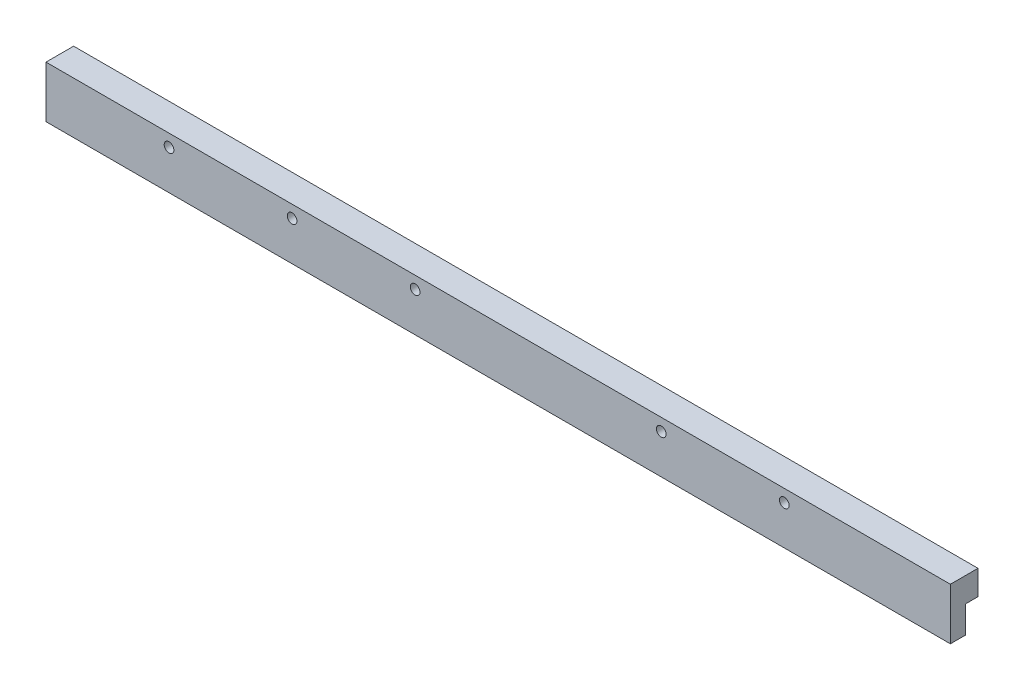
ISO-10303-21;
HEADER;
FILE_DESCRIPTION(('STEP AP214'),'2;1');
FILE_NAME('part.step','',(''),(''),'','','');
FILE_SCHEMA(('AUTOMOTIVE_DESIGN { 1 0 10303 214 1 1 1 1 }'));
ENDSEC;
DATA;
#1=APPLICATION_CONTEXT('core data for automotive mechanical design processes');
#2=APPLICATION_PROTOCOL_DEFINITION('international standard','automotive_design',2000,#1);
#3=PRODUCT_CONTEXT('',#1,'mechanical');
#4=PRODUCT('Part','Part','',(#3));
#5=PRODUCT_RELATED_PRODUCT_CATEGORY('part','',(#4));
#6=PRODUCT_DEFINITION_FORMATION('','',#4);
#7=PRODUCT_DEFINITION_CONTEXT('part definition',#1,'design');
#8=PRODUCT_DEFINITION('design','',#6,#7);
#9=PRODUCT_DEFINITION_SHAPE('','',#8);
#10=(LENGTH_UNIT() NAMED_UNIT(*) SI_UNIT(.MILLI.,.METRE.));
#11=(NAMED_UNIT(*) PLANE_ANGLE_UNIT() SI_UNIT($,.RADIAN.));
#12=(NAMED_UNIT(*) SI_UNIT($,.STERADIAN.) SOLID_ANGLE_UNIT());
#13=UNCERTAINTY_MEASURE_WITH_UNIT(LENGTH_MEASURE(1.E-05),#10,'distance_accuracy_value','');
#14=(GEOMETRIC_REPRESENTATION_CONTEXT(3) GLOBAL_UNCERTAINTY_ASSIGNED_CONTEXT((#13)) GLOBAL_UNIT_ASSIGNED_CONTEXT((#10,
#11,#12)) REPRESENTATION_CONTEXT('',''));
#15=CARTESIAN_POINT('',(0.,0.,0.));
#16=DIRECTION('',(0.,0.,1.));
#17=DIRECTION('',(1.,0.,0.));
#18=AXIS2_PLACEMENT_3D('',#15,#16,#17);
#19=CARTESIAN_POINT('',(294.866232670003,0.,174.625));
#20=DIRECTION('',(-1.,0.,0.));
#21=DIRECTION('',(0.,0.,1.));
#22=AXIS2_PLACEMENT_3D('',#19,#20,#21);
#23=PLANE('',#22);
#24=DIRECTION('',(0.,0.,1.));
#25=VECTOR('',#24,1.);
#26=CARTESIAN_POINT('',(294.866232670003,186.711667893958,177.8));
#27=LINE('',#26,#25);
#28=CARTESIAN_POINT('',(294.866232670003,186.711667893958,177.8));
#29=VERTEX_POINT('',#28);
#30=CARTESIAN_POINT('',(294.866232670003,186.711667893958,182.894919020045));
#31=VERTEX_POINT('',#30);
#32=EDGE_CURVE('E138',#29,#31,#27,.T.);
#33=ORIENTED_EDGE('',*,*,#32,.F.);
#34=DIRECTION('',(0.,-1.,0.));
#35=VECTOR('',#34,1.);
#36=CARTESIAN_POINT('',(294.866232670003,308.577623289676,177.8));
#37=LINE('',#36,#35);
#38=CARTESIAN_POINT('',(294.866232670003,196.871667893958,177.8));
#39=VERTEX_POINT('',#38);
#40=EDGE_CURVE('E201',#39,#29,#37,.T.);
#41=ORIENTED_EDGE('',*,*,#40,.F.);
#42=DIRECTION('',(0.,0.,1.));
#43=VECTOR('',#42,1.);
#44=CARTESIAN_POINT('',(294.866232670003,196.871667893958,177.8));
#45=LINE('',#44,#43);
#46=CARTESIAN_POINT('',(294.866232670003,196.871667893958,189.205822057911));
#47=VERTEX_POINT('',#46);
#48=EDGE_CURVE('E141',#39,#47,#45,.T.);
#49=ORIENTED_EDGE('',*,*,#48,.T.);
#50=DIRECTION('',(0.,-1.,0.));
#51=VECTOR('',#50,1.);
#52=CARTESIAN_POINT('',(294.866232670003,0.,189.205822057911));
#53=LINE('',#52,#51);
#54=CARTESIAN_POINT('',(294.866232670003,175.560674011247,189.205822057911));
#55=VERTEX_POINT('',#54);
#56=EDGE_CURVE('E146',#47,#55,#53,.T.);
#57=ORIENTED_EDGE('',*,*,#56,.T.);
#58=DIRECTION('',(0.,0.,1.));
#59=VECTOR('',#58,1.);
#60=CARTESIAN_POINT('',(294.866232670003,175.560674011247,177.8));
#61=LINE('',#60,#59);
#62=CARTESIAN_POINT('',(294.866232670003,175.560674011247,182.894919020045));
#63=VERTEX_POINT('',#62);
#64=EDGE_CURVE('E120',#63,#55,#61,.T.);
#65=ORIENTED_EDGE('',*,*,#64,.F.);
#66=DIRECTION('',(0.,1.,0.));
#67=VECTOR('',#66,1.);
#68=CARTESIAN_POINT('',(294.866232670003,0.,182.894919020045));
#69=LINE('',#68,#67);
#70=EDGE_CURVE('E151',#63,#31,#69,.T.);
#71=ORIENTED_EDGE('',*,*,#70,.T.);
#72=EDGE_LOOP('',(#33,#41,#49,#57,#65,#71));
#73=FACE_BOUND('',#72,.T.);
#74=ADVANCED_FACE('F47',(#73),#23,.F.);
#75=CARTESIAN_POINT('',(-78.5137673299967,0.,177.8));
#76=DIRECTION('',(0.,0.,-1.));
#77=DIRECTION('',(-1.,0.,0.));
#78=AXIS2_PLACEMENT_3D('',#75,#76,#77);
#79=PLANE('',#78);
#80=CARTESIAN_POINT('',(175.486232670003,191.791667893958,177.8));
#81=DIRECTION('',(0.,0.,-1.));
#82=DIRECTION('',(-1.,0.,0.));
#83=AXIS2_PLACEMENT_3D('',#80,#81,#82);
#84=CIRCLE('',#83,2.);
#85=CARTESIAN_POINT('',(175.486232670003,193.791667893958,177.8));
#86=VERTEX_POINT('',#85);
#87=EDGE_CURVE('E142',#86,#86,#84,.T.);
#88=ORIENTED_EDGE('',*,*,#87,.F.);
#89=EDGE_LOOP('',(#88));
#90=FACE_BOUND('',#89,.T.);
#91=DIRECTION('',(1.,0.,0.));
#92=VECTOR('',#91,1.);
#93=CARTESIAN_POINT('',(-78.5137673299967,186.711667893958,177.8));
#94=LINE('',#93,#92);
#95=CARTESIAN_POINT('',(-78.5137673299967,186.711667893958,177.8));
#96=VERTEX_POINT('',#95);
#97=EDGE_CURVE('E11',#96,#29,#94,.T.);
#98=ORIENTED_EDGE('',*,*,#97,.F.);
#99=DIRECTION('',(0.,1.,0.));
#100=VECTOR('',#99,1.);
#101=CARTESIAN_POINT('',(-78.5137673299967,0.,177.8));
#102=LINE('',#101,#100);
#103=CARTESIAN_POINT('',(-78.5137673299967,196.871667893958,177.8));
#104=VERTEX_POINT('',#103);
#105=EDGE_CURVE('E132',#96,#104,#102,.T.);
#106=ORIENTED_EDGE('',*,*,#105,.T.);
#107=DIRECTION('',(1.,0.,0.));
#108=VECTOR('',#107,1.);
#109=CARTESIAN_POINT('',(-78.5137673299967,196.871667893958,177.8));
#110=LINE('',#109,#108);
#111=EDGE_CURVE('E57',#104,#39,#110,.T.);
#112=ORIENTED_EDGE('',*,*,#111,.T.);
#113=ORIENTED_EDGE('',*,*,#40,.T.);
#114=EDGE_LOOP('',(#98,#106,#112,#113));
#115=FACE_BOUND('',#114,.T.);
#116=CARTESIAN_POINT('',(226.286232670003,191.737623289676,177.8));
#117=DIRECTION('',(0.,0.,1.));
#118=DIRECTION('',(1.,0.,0.));
#119=AXIS2_PLACEMENT_3D('',#116,#117,#118);
#120=CIRCLE('',#119,2.);
#121=CARTESIAN_POINT('',(228.286232670003,191.737623289676,177.8));
#122=VERTEX_POINT('',#121);
#123=EDGE_CURVE('E203',#122,#122,#120,.F.);
#124=ORIENTED_EDGE('',*,*,#123,.F.);
#125=EDGE_LOOP('',(#124));
#126=FACE_BOUND('',#125,.T.);
#127=CARTESIAN_POINT('',(-27.7137673299967,191.791667893958,177.8));
#128=DIRECTION('',(0.,0.,-1.));
#129=DIRECTION('',(-1.,0.,0.));
#130=AXIS2_PLACEMENT_3D('',#127,#128,#129);
#131=CIRCLE('',#130,2.);
#132=CARTESIAN_POINT('',(-27.7137673299967,193.791667893958,177.8));
#133=VERTEX_POINT('',#132);
#134=EDGE_CURVE('E164',#133,#133,#131,.T.);
#135=ORIENTED_EDGE('',*,*,#134,.F.);
#136=EDGE_LOOP('',(#135));
#137=FACE_BOUND('',#136,.T.);
#138=CARTESIAN_POINT('',(23.0862326700033,191.791667893958,177.8));
#139=DIRECTION('',(0.,0.,1.));
#140=DIRECTION('',(1.,0.,0.));
#141=AXIS2_PLACEMENT_3D('',#138,#139,#140);
#142=CIRCLE('',#141,2.);
#143=CARTESIAN_POINT('',(25.0862326700033,191.791667893958,177.8));
#144=VERTEX_POINT('',#143);
#145=EDGE_CURVE('E213',#144,#144,#142,.F.);
#146=ORIENTED_EDGE('',*,*,#145,.F.);
#147=EDGE_LOOP('',(#146));
#148=FACE_BOUND('',#147,.T.);
#149=CARTESIAN_POINT('',(73.8862326700033,191.791667893958,177.8));
#150=DIRECTION('',(0.,0.,1.));
#151=DIRECTION('',(1.,0.,0.));
#152=AXIS2_PLACEMENT_3D('',#149,#150,#151);
#153=CIRCLE('',#152,2.);
#154=CARTESIAN_POINT('',(75.8862326700033,191.791667893958,177.8));
#155=VERTEX_POINT('',#154);
#156=EDGE_CURVE('E207',#155,#155,#153,.F.);
#157=ORIENTED_EDGE('',*,*,#156,.F.);
#158=EDGE_LOOP('',(#157));
#159=FACE_BOUND('',#158,.T.);
#160=ADVANCED_FACE('F192',(#90,#115,#126,#137,#148,#159),#79,.T.);
#161=CARTESIAN_POINT('',(-78.5137673299967,186.711667893958,177.8));
#162=DIRECTION('',(0.,1.,0.));
#163=DIRECTION('',(0.,0.,1.));
#164=AXIS2_PLACEMENT_3D('',#161,#162,#163);
#165=PLANE('',#164);
#166=ORIENTED_EDGE('',*,*,#32,.T.);
#167=DIRECTION('',(1.,0.,0.));
#168=VECTOR('',#167,1.);
#169=CARTESIAN_POINT('',(-78.5137673299967,186.711667893958,182.894919020045));
#170=LINE('',#169,#168);
#171=CARTESIAN_POINT('',(-78.5137673299967,186.711667893958,182.894919020045));
#172=VERTEX_POINT('',#171);
#173=EDGE_CURVE('E91',#172,#31,#170,.T.);
#174=ORIENTED_EDGE('',*,*,#173,.F.);
#175=DIRECTION('',(0.,0.,1.));
#176=VECTOR('',#175,1.);
#177=CARTESIAN_POINT('',(-78.5137673299967,186.711667893958,177.8));
#178=LINE('',#177,#176);
#179=EDGE_CURVE('E66',#96,#172,#178,.T.);
#180=ORIENTED_EDGE('',*,*,#179,.F.);
#181=ORIENTED_EDGE('',*,*,#97,.T.);
#182=EDGE_LOOP('',(#166,#174,#180,#181));
#183=FACE_BOUND('',#182,.T.);
#184=ADVANCED_FACE('F242',(#183),#165,.F.);
#185=CARTESIAN_POINT('',(-78.5137673299967,0.,182.894919020045));
#186=DIRECTION('',(0.,0.,-1.));
#187=DIRECTION('',(-1.,0.,0.));
#188=AXIS2_PLACEMENT_3D('',#185,#186,#187);
#189=PLANE('',#188);
#190=ORIENTED_EDGE('',*,*,#70,.F.);
#191=DIRECTION('',(1.,0.,0.));
#192=VECTOR('',#191,1.);
#193=CARTESIAN_POINT('',(-78.5137673299967,175.560674011247,182.894919020045));
#194=LINE('',#193,#192);
#195=CARTESIAN_POINT('',(-78.5137673299967,175.560674011247,182.894919020045));
#196=VERTEX_POINT('',#195);
#197=EDGE_CURVE('E84',#196,#63,#194,.T.);
#198=ORIENTED_EDGE('',*,*,#197,.F.);
#199=DIRECTION('',(0.,1.,0.));
#200=VECTOR('',#199,1.);
#201=CARTESIAN_POINT('',(-78.5137673299967,0.,182.894919020045));
#202=LINE('',#201,#200);
#203=EDGE_CURVE('E115',#196,#172,#202,.T.);
#204=ORIENTED_EDGE('',*,*,#203,.T.);
#205=ORIENTED_EDGE('',*,*,#173,.T.);
#206=EDGE_LOOP('',(#190,#198,#204,#205));
#207=FACE_BOUND('',#206,.T.);
#208=ADVANCED_FACE('F280',(#207),#189,.T.);
#209=CARTESIAN_POINT('',(-78.5137673299967,175.560674011247,177.8));
#210=DIRECTION('',(0.,1.,0.));
#211=DIRECTION('',(0.,0.,1.));
#212=AXIS2_PLACEMENT_3D('',#209,#210,#211);
#213=PLANE('',#212);
#214=ORIENTED_EDGE('',*,*,#64,.T.);
#215=DIRECTION('',(1.,0.,0.));
#216=VECTOR('',#215,1.);
#217=CARTESIAN_POINT('',(-78.5137673299967,175.560674011247,189.205822057911));
#218=LINE('',#217,#216);
#219=CARTESIAN_POINT('',(-78.5137673299967,175.560674011247,189.205822057911));
#220=VERTEX_POINT('',#219);
#221=EDGE_CURVE('E118',#220,#55,#218,.T.);
#222=ORIENTED_EDGE('',*,*,#221,.F.);
#223=DIRECTION('',(0.,0.,1.));
#224=VECTOR('',#223,1.);
#225=CARTESIAN_POINT('',(-78.5137673299967,175.560674011247,177.8));
#226=LINE('',#225,#224);
#227=EDGE_CURVE('E108',#196,#220,#226,.T.);
#228=ORIENTED_EDGE('',*,*,#227,.F.);
#229=ORIENTED_EDGE('',*,*,#197,.T.);
#230=EDGE_LOOP('',(#214,#222,#228,#229));
#231=FACE_BOUND('',#230,.T.);
#232=ADVANCED_FACE('F119',(#231),#213,.F.);
#233=CARTESIAN_POINT('',(-78.5137673299967,0.,189.205822057911));
#234=DIRECTION('',(0.,0.,1.));
#235=DIRECTION('',(0.,-1.,0.));
#236=AXIS2_PLACEMENT_3D('',#233,#234,#235);
#237=PLANE('',#236);
#238=CARTESIAN_POINT('',(226.286232670003,191.737623289676,189.205822057911));
#239=DIRECTION('',(0.,0.,1.));
#240=DIRECTION('',(1.,0.,0.));
#241=AXIS2_PLACEMENT_3D('',#238,#239,#240);
#242=CIRCLE('',#241,2.);
#243=CARTESIAN_POINT('',(228.286232670003,191.737623289676,189.205822057911));
#244=VERTEX_POINT('',#243);
#245=EDGE_CURVE('E169',#244,#244,#242,.T.);
#246=ORIENTED_EDGE('',*,*,#245,.F.);
#247=EDGE_LOOP('',(#246));
#248=FACE_BOUND('',#247,.T.);
#249=CARTESIAN_POINT('',(175.486232670003,191.791667893958,189.205822057911));
#250=DIRECTION('',(0.,0.,1.));
#251=DIRECTION('',(0.,-1.,0.));
#252=AXIS2_PLACEMENT_3D('',#249,#250,#251);
#253=CIRCLE('',#252,2.);
#254=CARTESIAN_POINT('',(175.486232670003,193.791667893958,189.205822057911));
#255=VERTEX_POINT('',#254);
#256=EDGE_CURVE('E50',#255,#255,#253,.T.);
#257=ORIENTED_EDGE('',*,*,#256,.F.);
#258=EDGE_LOOP('',(#257));
#259=FACE_BOUND('',#258,.T.);
#260=CARTESIAN_POINT('',(73.8862326700033,191.791667893958,189.205822057911));
#261=DIRECTION('',(0.,0.,1.));
#262=DIRECTION('',(0.,-1.,0.));
#263=AXIS2_PLACEMENT_3D('',#260,#261,#262);
#264=CIRCLE('',#263,2.);
#265=CARTESIAN_POINT('',(73.8862326700033,189.791667893958,189.205822057911));
#266=VERTEX_POINT('',#265);
#267=EDGE_CURVE('E173',#266,#266,#264,.T.);
#268=ORIENTED_EDGE('',*,*,#267,.F.);
#269=EDGE_LOOP('',(#268));
#270=FACE_BOUND('',#269,.T.);
#271=CARTESIAN_POINT('',(23.0862326700033,191.791667893958,189.205822057911));
#272=DIRECTION('',(0.,0.,1.));
#273=DIRECTION('',(0.,-1.,0.));
#274=AXIS2_PLACEMENT_3D('',#271,#272,#273);
#275=CIRCLE('',#274,2.);
#276=CARTESIAN_POINT('',(23.0862326700033,189.791667893958,189.205822057911));
#277=VERTEX_POINT('',#276);
#278=EDGE_CURVE('E170',#277,#277,#275,.T.);
#279=ORIENTED_EDGE('',*,*,#278,.F.);
#280=EDGE_LOOP('',(#279));
#281=FACE_BOUND('',#280,.T.);
#282=CARTESIAN_POINT('',(-27.7137673299967,191.791667893958,189.205822057911));
#283=DIRECTION('',(0.,0.,1.));
#284=DIRECTION('',(0.,-1.,0.));
#285=AXIS2_PLACEMENT_3D('',#282,#283,#284);
#286=CIRCLE('',#285,2.);
#287=CARTESIAN_POINT('',(-27.7137673299967,193.791667893958,189.205822057911));
#288=VERTEX_POINT('',#287);
#289=EDGE_CURVE('E168',#288,#288,#286,.T.);
#290=ORIENTED_EDGE('',*,*,#289,.F.);
#291=EDGE_LOOP('',(#290));
#292=FACE_BOUND('',#291,.T.);
#293=ORIENTED_EDGE('',*,*,#56,.F.);
#294=DIRECTION('',(1.,0.,0.));
#295=VECTOR('',#294,1.);
#296=CARTESIAN_POINT('',(-78.5137673299967,196.871667893958,189.205822057911));
#297=LINE('',#296,#295);
#298=CARTESIAN_POINT('',(-78.5137673299967,196.871667893958,189.205822057911));
#299=VERTEX_POINT('',#298);
#300=EDGE_CURVE('E125',#299,#47,#297,.T.);
#301=ORIENTED_EDGE('',*,*,#300,.F.);
#302=DIRECTION('',(0.,-1.,0.));
#303=VECTOR('',#302,1.);
#304=CARTESIAN_POINT('',(-78.5137673299967,0.,189.205822057911));
#305=LINE('',#304,#303);
#306=EDGE_CURVE('E113',#299,#220,#305,.T.);
#307=ORIENTED_EDGE('',*,*,#306,.T.);
#308=ORIENTED_EDGE('',*,*,#221,.T.);
#309=EDGE_LOOP('',(#293,#301,#307,#308));
#310=FACE_BOUND('',#309,.T.);
#311=ADVANCED_FACE('F127',(#248,#259,#270,#281,#292,#310),#237,.T.);
#312=CARTESIAN_POINT('',(-78.5137673299967,196.871667893958,177.8));
#313=DIRECTION('',(0.,1.,0.));
#314=DIRECTION('',(0.,0.,1.));
#315=AXIS2_PLACEMENT_3D('',#312,#313,#314);
#316=PLANE('',#315);
#317=ORIENTED_EDGE('',*,*,#48,.F.);
#318=ORIENTED_EDGE('',*,*,#111,.F.);
#319=DIRECTION('',(0.,0.,1.));
#320=VECTOR('',#319,1.);
#321=CARTESIAN_POINT('',(-78.5137673299967,196.871667893958,177.8));
#322=LINE('',#321,#320);
#323=EDGE_CURVE('E129',#104,#299,#322,.T.);
#324=ORIENTED_EDGE('',*,*,#323,.T.);
#325=ORIENTED_EDGE('',*,*,#300,.T.);
#326=EDGE_LOOP('',(#317,#318,#324,#325));
#327=FACE_BOUND('',#326,.T.);
#328=ADVANCED_FACE('F198',(#327),#316,.T.);
#329=CARTESIAN_POINT('',(-78.5137673299967,0.,177.8));
#330=DIRECTION('',(1.,0.,0.));
#331=DIRECTION('',(0.,0.,1.));
#332=AXIS2_PLACEMENT_3D('',#329,#330,#331);
#333=PLANE('',#332);
#334=ORIENTED_EDGE('',*,*,#179,.T.);
#335=ORIENTED_EDGE('',*,*,#203,.F.);
#336=ORIENTED_EDGE('',*,*,#227,.T.);
#337=ORIENTED_EDGE('',*,*,#306,.F.);
#338=ORIENTED_EDGE('',*,*,#323,.F.);
#339=ORIENTED_EDGE('',*,*,#105,.F.);
#340=EDGE_LOOP('',(#334,#335,#336,#337,#338,#339));
#341=FACE_BOUND('',#340,.T.);
#342=ADVANCED_FACE('F110',(#341),#333,.F.);
#343=CARTESIAN_POINT('',(-27.7137673299967,191.791667893958,191.794177942089));
#344=DIRECTION('',(0.,0.,-1.));
#345=DIRECTION('',(0.,1.,0.));
#346=AXIS2_PLACEMENT_3D('',#343,#344,#345);
#347=CYLINDRICAL_SURFACE('',#346,2.);
#348=CARTESIAN_POINT('',(-27.7137673299967,193.791667893958,189.205822057911));
#349=CARTESIAN_POINT('',(-27.7137673299967,193.791667893958,189.087011411474));
#350=CARTESIAN_POINT('',(-27.7137673299967,193.791667893958,188.968200765038));
#351=CARTESIAN_POINT('',(-27.7137673299967,193.791667893958,188.730579472165));
#352=CARTESIAN_POINT('',(-27.7137673299967,193.791667893958,188.611768825728));
#353=CARTESIAN_POINT('',(-27.7137673299967,193.791667893958,188.374147532855));
#354=CARTESIAN_POINT('',(-27.7137673299967,193.791667893958,188.255336886418));
#355=CARTESIAN_POINT('',(-27.7137673299967,193.791667893958,188.017715593545));
#356=CARTESIAN_POINT('',(-27.7137673299967,193.791667893958,187.898904947109));
#357=CARTESIAN_POINT('',(-27.7137673299967,193.791667893958,187.661283654236));
#358=CARTESIAN_POINT('',(-27.7137673299967,193.791667893958,187.542473007799));
#359=CARTESIAN_POINT('',(-27.7137673299967,193.791667893958,187.304851714926));
#360=CARTESIAN_POINT('',(-27.7137673299967,193.791667893958,187.186041068489));
#361=CARTESIAN_POINT('',(-27.7137673299967,193.791667893958,186.948419775616));
#362=CARTESIAN_POINT('',(-27.7137673299967,193.791667893958,186.829609129179));
#363=CARTESIAN_POINT('',(-27.7137673299967,193.791667893958,186.591987836306));
#364=CARTESIAN_POINT('',(-27.7137673299967,193.791667893958,186.47317718987));
#365=CARTESIAN_POINT('',(-27.7137673299967,193.791667893958,186.235555896997));
#366=CARTESIAN_POINT('',(-27.7137673299967,193.791667893958,186.11674525056));
#367=CARTESIAN_POINT('',(-27.7137673299967,193.791667893958,185.879123957687));
#368=CARTESIAN_POINT('',(-27.7137673299967,193.791667893958,185.76031331125));
#369=CARTESIAN_POINT('',(-27.7137673299967,193.791667893958,185.522692018377));
#370=CARTESIAN_POINT('',(-27.7137673299967,193.791667893958,185.403881371941));
#371=CARTESIAN_POINT('',(-27.7137673299967,193.791667893958,185.166260079067));
#372=CARTESIAN_POINT('',(-27.7137673299967,193.791667893958,185.047449432631));
#373=CARTESIAN_POINT('',(-27.7137673299967,193.791667893958,184.809828139758));
#374=CARTESIAN_POINT('',(-27.7137673299967,193.791667893958,184.691017493321));
#375=CARTESIAN_POINT('',(-27.7137673299967,193.791667893958,184.453396200448));
#376=CARTESIAN_POINT('',(-27.7137673299967,193.791667893958,184.334585554011));
#377=CARTESIAN_POINT('',(-27.7137673299967,193.791667893958,184.096964261138));
#378=CARTESIAN_POINT('',(-27.7137673299967,193.791667893958,183.978153614702));
#379=CARTESIAN_POINT('',(-27.7137673299967,193.791667893958,183.740532321829));
#380=CARTESIAN_POINT('',(-27.7137673299967,193.791667893958,183.621721675392));
#381=CARTESIAN_POINT('',(-27.7137673299967,193.791667893958,183.384100382519));
#382=CARTESIAN_POINT('',(-27.7137673299967,193.791667893958,183.265289736082));
#383=CARTESIAN_POINT('',(-27.7137673299967,193.791667893958,183.027668443209));
#384=CARTESIAN_POINT('',(-27.7137673299967,193.791667893958,182.908857796773));
#385=CARTESIAN_POINT('',(-27.7137673299967,193.791667893958,182.671236503899));
#386=CARTESIAN_POINT('',(-27.7137673299967,193.791667893958,182.552425857463));
#387=CARTESIAN_POINT('',(-27.7137673299967,193.791667893958,182.31480456459));
#388=CARTESIAN_POINT('',(-27.7137673299967,193.791667893958,182.195993918153));
#389=CARTESIAN_POINT('',(-27.7137673299967,193.791667893958,181.95837262528));
#390=CARTESIAN_POINT('',(-27.7137673299967,193.791667893958,181.839561978843));
#391=CARTESIAN_POINT('',(-27.7137673299967,193.791667893958,181.60194068597));
#392=CARTESIAN_POINT('',(-27.7137673299967,193.791667893958,181.483130039534));
#393=CARTESIAN_POINT('',(-27.7137673299967,193.791667893958,181.245508746661));
#394=CARTESIAN_POINT('',(-27.7137673299967,193.791667893958,181.126698100224));
#395=CARTESIAN_POINT('',(-27.7137673299967,193.791667893958,180.889076807351));
#396=CARTESIAN_POINT('',(-27.7137673299967,193.791667893958,180.770266160914));
#397=CARTESIAN_POINT('',(-27.7137673299967,193.791667893958,180.532644868041));
#398=CARTESIAN_POINT('',(-27.7137673299967,193.791667893958,180.413834221605));
#399=CARTESIAN_POINT('',(-27.7137673299967,193.791667893958,180.176212928731));
#400=CARTESIAN_POINT('',(-27.7137673299967,193.791667893958,180.057402282295));
#401=CARTESIAN_POINT('',(-27.7137673299967,193.791667893958,179.819780989422));
#402=CARTESIAN_POINT('',(-27.7137673299967,193.791667893958,179.700970342985));
#403=CARTESIAN_POINT('',(-27.7137673299967,193.791667893958,179.463349050112));
#404=CARTESIAN_POINT('',(-27.7137673299967,193.791667893958,179.344538403675));
#405=CARTESIAN_POINT('',(-27.7137673299967,193.791667893958,179.106917110802));
#406=CARTESIAN_POINT('',(-27.7137673299967,193.791667893958,178.988106464366));
#407=CARTESIAN_POINT('',(-27.7137673299967,193.791667893958,178.750485171493));
#408=CARTESIAN_POINT('',(-27.7137673299967,193.791667893958,178.631674525056));
#409=CARTESIAN_POINT('',(-27.7137673299967,193.791667893958,178.394053232183));
#410=CARTESIAN_POINT('',(-27.7137673299967,193.791667893958,178.275242585746));
#411=CARTESIAN_POINT('',(-27.7137673299967,193.791667893958,178.037621292873));
#412=CARTESIAN_POINT('',(-27.7137673299967,193.791667893958,177.918810646437));
#413=CARTESIAN_POINT('',(-27.7137673299967,193.791667893958,177.8));
#414=B_SPLINE_CURVE_WITH_KNOTS('',3,(#348,#349,#350,#351,#352,#353,#354,#355,#356,#357,#358,
#359,#360,#361,#362,#363,#364,#365,#366,#367,#368,#369,#370,#371,#372,#373,#374,#375,#376,#377,
#378,#379,#380,#381,#382,#383,#384,#385,#386,#387,#388,#389,#390,#391,#392,#393,#394,#395,#396,
#397,#398,#399,#400,#401,#402,#403,#404,#405,#406,#407,#408,#409,#410,#411,#412,#413),
.UNSPECIFIED.,.F.,.F.,(4,2,2,2,2,2,2,2,2,2,2,2,2,2,2,2,2,2,2,2,2,2,2,2,2,2,2,2,2,2,2,2,4),(0.,
0.356431939309704,0.712863878619407,1.06929581792914,1.42572775723884,1.78215969654857,
2.13859163585828,2.49502357516801,2.85145551447771,3.20788745378744,3.56431939309715,
3.92075133240688,4.27718327171658,4.63361521102632,4.99004715033602,5.34647908964575,
5.70291102895545,6.05934296826516,6.41577490757489,6.77220684688459,7.12863878619432,
7.48507072550403,7.84150266481376,8.19793460412346,8.5543665434332,8.9107984827429,
9.26723042205263,9.62366236136233,9.98009430067207,10.3365262399818,10.6929581792915,
11.0493901186012,11.4058220579109),.UNSPECIFIED.);
#415=EDGE_CURVE('BSEAM233',#288,#133,#414,.T.);
#416=ORIENTED_EDGE('',*,*,#289,.T.);
#417=ORIENTED_EDGE('',*,*,#134,.T.);
#418=ORIENTED_EDGE('',*,*,#415,.T.);
#419=ORIENTED_EDGE('',*,*,#415,.F.);
#420=EDGE_LOOP('',(#416,#418,#417,#419));
#421=FACE_BOUND('',#420,.T.);
#422=ADVANCED_FACE('F233',(#421),#347,.F.);
#423=CARTESIAN_POINT('',(23.0862326700033,191.791667893958,191.794177942089));
#424=DIRECTION('',(0.,0.,-1.));
#425=DIRECTION('',(0.,1.,0.));
#426=AXIS2_PLACEMENT_3D('',#423,#424,#425);
#427=CYLINDRICAL_SURFACE('',#426,2.);
#428=ORIENTED_EDGE('',*,*,#145,.T.);
#429=EDGE_LOOP('',(#428));
#430=FACE_BOUND('',#429,.T.);
#431=ORIENTED_EDGE('',*,*,#278,.T.);
#432=EDGE_LOOP('',(#431));
#433=FACE_BOUND('',#432,.T.);
#434=ADVANCED_FACE('F236',(#430,#433),#427,.F.);
#435=CARTESIAN_POINT('',(73.8862326700033,191.791667893958,191.794177942089));
#436=DIRECTION('',(0.,0.,-1.));
#437=DIRECTION('',(0.,1.,0.));
#438=AXIS2_PLACEMENT_3D('',#435,#436,#437);
#439=CYLINDRICAL_SURFACE('',#438,2.);
#440=ORIENTED_EDGE('',*,*,#156,.T.);
#441=EDGE_LOOP('',(#440));
#442=FACE_BOUND('',#441,.T.);
#443=ORIENTED_EDGE('',*,*,#267,.T.);
#444=EDGE_LOOP('',(#443));
#445=FACE_BOUND('',#444,.T.);
#446=ADVANCED_FACE('F249',(#442,#445),#439,.F.);
#447=CARTESIAN_POINT('',(175.486232670003,191.791667893958,191.794177942089));
#448=DIRECTION('',(0.,0.,-1.));
#449=DIRECTION('',(0.,1.,0.));
#450=AXIS2_PLACEMENT_3D('',#447,#448,#449);
#451=CYLINDRICAL_SURFACE('',#450,2.);
#452=CARTESIAN_POINT('',(175.486232670003,193.791667893958,177.8));
#453=CARTESIAN_POINT('',(175.486232670003,193.791667893958,177.918810646437));
#454=CARTESIAN_POINT('',(175.486232670003,193.791667893958,178.037621292873));
#455=CARTESIAN_POINT('',(175.486232670003,193.791667893958,178.275242585746));
#456=CARTESIAN_POINT('',(175.486232670003,193.791667893958,178.394053232183));
#457=CARTESIAN_POINT('',(175.486232670003,193.791667893958,178.631674525056));
#458=CARTESIAN_POINT('',(175.486232670003,193.791667893958,178.750485171493));
#459=CARTESIAN_POINT('',(175.486232670003,193.791667893958,178.988106464366));
#460=CARTESIAN_POINT('',(175.486232670003,193.791667893958,179.106917110802));
#461=CARTESIAN_POINT('',(175.486232670003,193.791667893958,179.344538403675));
#462=CARTESIAN_POINT('',(175.486232670003,193.791667893958,179.463349050112));
#463=CARTESIAN_POINT('',(175.486232670003,193.791667893958,179.700970342985));
#464=CARTESIAN_POINT('',(175.486232670003,193.791667893958,179.819780989422));
#465=CARTESIAN_POINT('',(175.486232670003,193.791667893958,180.057402282295));
#466=CARTESIAN_POINT('',(175.486232670003,193.791667893958,180.176212928731));
#467=CARTESIAN_POINT('',(175.486232670003,193.791667893958,180.413834221605));
#468=CARTESIAN_POINT('',(175.486232670003,193.791667893958,180.532644868041));
#469=CARTESIAN_POINT('',(175.486232670003,193.791667893958,180.770266160914));
#470=CARTESIAN_POINT('',(175.486232670003,193.791667893958,180.889076807351));
#471=CARTESIAN_POINT('',(175.486232670003,193.791667893958,181.126698100224));
#472=CARTESIAN_POINT('',(175.486232670003,193.791667893958,181.245508746661));
#473=CARTESIAN_POINT('',(175.486232670003,193.791667893958,181.483130039534));
#474=CARTESIAN_POINT('',(175.486232670003,193.791667893958,181.60194068597));
#475=CARTESIAN_POINT('',(175.486232670003,193.791667893958,181.839561978843));
#476=CARTESIAN_POINT('',(175.486232670003,193.791667893958,181.95837262528));
#477=CARTESIAN_POINT('',(175.486232670003,193.791667893958,182.195993918153));
#478=CARTESIAN_POINT('',(175.486232670003,193.791667893958,182.31480456459));
#479=CARTESIAN_POINT('',(175.486232670003,193.791667893958,182.552425857463));
#480=CARTESIAN_POINT('',(175.486232670003,193.791667893958,182.671236503899));
#481=CARTESIAN_POINT('',(175.486232670003,193.791667893958,182.908857796773));
#482=CARTESIAN_POINT('',(175.486232670003,193.791667893958,183.027668443209));
#483=CARTESIAN_POINT('',(175.486232670003,193.791667893958,183.265289736082));
#484=CARTESIAN_POINT('',(175.486232670003,193.791667893958,183.384100382519));
#485=CARTESIAN_POINT('',(175.486232670003,193.791667893958,183.621721675392));
#486=CARTESIAN_POINT('',(175.486232670003,193.791667893958,183.740532321829));
#487=CARTESIAN_POINT('',(175.486232670003,193.791667893958,183.978153614702));
#488=CARTESIAN_POINT('',(175.486232670003,193.791667893958,184.096964261138));
#489=CARTESIAN_POINT('',(175.486232670003,193.791667893958,184.334585554011));
#490=CARTESIAN_POINT('',(175.486232670003,193.791667893958,184.453396200448));
#491=CARTESIAN_POINT('',(175.486232670003,193.791667893958,184.691017493321));
#492=CARTESIAN_POINT('',(175.486232670003,193.791667893958,184.809828139758));
#493=CARTESIAN_POINT('',(175.486232670003,193.791667893958,185.047449432631));
#494=CARTESIAN_POINT('',(175.486232670003,193.791667893958,185.166260079067));
#495=CARTESIAN_POINT('',(175.486232670003,193.791667893958,185.403881371941));
#496=CARTESIAN_POINT('',(175.486232670003,193.791667893958,185.522692018377));
#497=CARTESIAN_POINT('',(175.486232670003,193.791667893958,185.76031331125));
#498=CARTESIAN_POINT('',(175.486232670003,193.791667893958,185.879123957687));
#499=CARTESIAN_POINT('',(175.486232670003,193.791667893958,186.11674525056));
#500=CARTESIAN_POINT('',(175.486232670003,193.791667893958,186.235555896997));
#501=CARTESIAN_POINT('',(175.486232670003,193.791667893958,186.47317718987));
#502=CARTESIAN_POINT('',(175.486232670003,193.791667893958,186.591987836306));
#503=CARTESIAN_POINT('',(175.486232670003,193.791667893958,186.829609129179));
#504=CARTESIAN_POINT('',(175.486232670003,193.791667893958,186.948419775616));
#505=CARTESIAN_POINT('',(175.486232670003,193.791667893958,187.186041068489));
#506=CARTESIAN_POINT('',(175.486232670003,193.791667893958,187.304851714926));
#507=CARTESIAN_POINT('',(175.486232670003,193.791667893958,187.542473007799));
#508=CARTESIAN_POINT('',(175.486232670003,193.791667893958,187.661283654236));
#509=CARTESIAN_POINT('',(175.486232670003,193.791667893958,187.898904947109));
#510=CARTESIAN_POINT('',(175.486232670003,193.791667893958,188.017715593545));
#511=CARTESIAN_POINT('',(175.486232670003,193.791667893958,188.255336886418));
#512=CARTESIAN_POINT('',(175.486232670003,193.791667893958,188.374147532855));
#513=CARTESIAN_POINT('',(175.486232670003,193.791667893958,188.611768825728));
#514=CARTESIAN_POINT('',(175.486232670003,193.791667893958,188.730579472165));
#515=CARTESIAN_POINT('',(175.486232670003,193.791667893958,188.968200765038));
#516=CARTESIAN_POINT('',(175.486232670003,193.791667893958,189.087011411474));
#517=CARTESIAN_POINT('',(175.486232670003,193.791667893958,189.205822057911));
#518=B_SPLINE_CURVE_WITH_KNOTS('',3,(#452,#453,#454,#455,#456,#457,#458,#459,#460,#461,#462,
#463,#464,#465,#466,#467,#468,#469,#470,#471,#472,#473,#474,#475,#476,#477,#478,#479,#480,#481,
#482,#483,#484,#485,#486,#487,#488,#489,#490,#491,#492,#493,#494,#495,#496,#497,#498,#499,#500,
#501,#502,#503,#504,#505,#506,#507,#508,#509,#510,#511,#512,#513,#514,#515,#516,#517),
.UNSPECIFIED.,.F.,.F.,(4,2,2,2,2,2,2,2,2,2,2,2,2,2,2,2,2,2,2,2,2,2,2,2,2,2,2,2,2,2,2,2,4),(0.,
0.356431939309704,0.712863878619407,1.06929581792914,1.42572775723884,1.78215969654857,
2.13859163585828,2.49502357516801,2.85145551447771,3.20788745378744,3.56431939309715,
3.92075133240688,4.27718327171658,4.63361521102632,4.99004715033602,5.34647908964575,
5.70291102895545,6.05934296826516,6.41577490757489,6.77220684688459,7.12863878619432,
7.48507072550403,7.84150266481376,8.19793460412346,8.5543665434332,8.9107984827429,
9.26723042205263,9.62366236136233,9.98009430067207,10.3365262399818,10.6929581792915,
11.0493901186012,11.4058220579109),.UNSPECIFIED.);
#519=EDGE_CURVE('BSEAM251',#86,#255,#518,.T.);
#520=ORIENTED_EDGE('',*,*,#87,.T.);
#521=ORIENTED_EDGE('',*,*,#256,.T.);
#522=ORIENTED_EDGE('',*,*,#519,.T.);
#523=ORIENTED_EDGE('',*,*,#519,.F.);
#524=EDGE_LOOP('',(#520,#522,#521,#523));
#525=FACE_BOUND('',#524,.T.);
#526=ADVANCED_FACE('F251',(#525),#451,.F.);
#527=CARTESIAN_POINT('',(226.286232670003,191.737623289676,138.405822057911));
#528=DIRECTION('',(0.,0.,1.));
#529=DIRECTION('',(1.,0.,0.));
#530=AXIS2_PLACEMENT_3D('',#527,#528,#529);
#531=CYLINDRICAL_SURFACE('',#530,2.);
#532=ORIENTED_EDGE('',*,*,#123,.T.);
#533=EDGE_LOOP('',(#532));
#534=FACE_BOUND('',#533,.T.);
#535=ORIENTED_EDGE('',*,*,#245,.T.);
#536=EDGE_LOOP('',(#535));
#537=FACE_BOUND('',#536,.T.);
#538=ADVANCED_FACE('F220',(#534,#537),#531,.F.);
#539=CLOSED_SHELL('',(#74,#160,#184,#208,#232,#311,#328,#342,#422,#434,#446,#526,#538));
#540=MANIFOLD_SOLID_BREP('B2',#539);
#541=ADVANCED_BREP_SHAPE_REPRESENTATION('',(#18,#540),#14);
#542=SHAPE_DEFINITION_REPRESENTATION(#9,#541);
ENDSEC;
END-ISO-10303-21;
